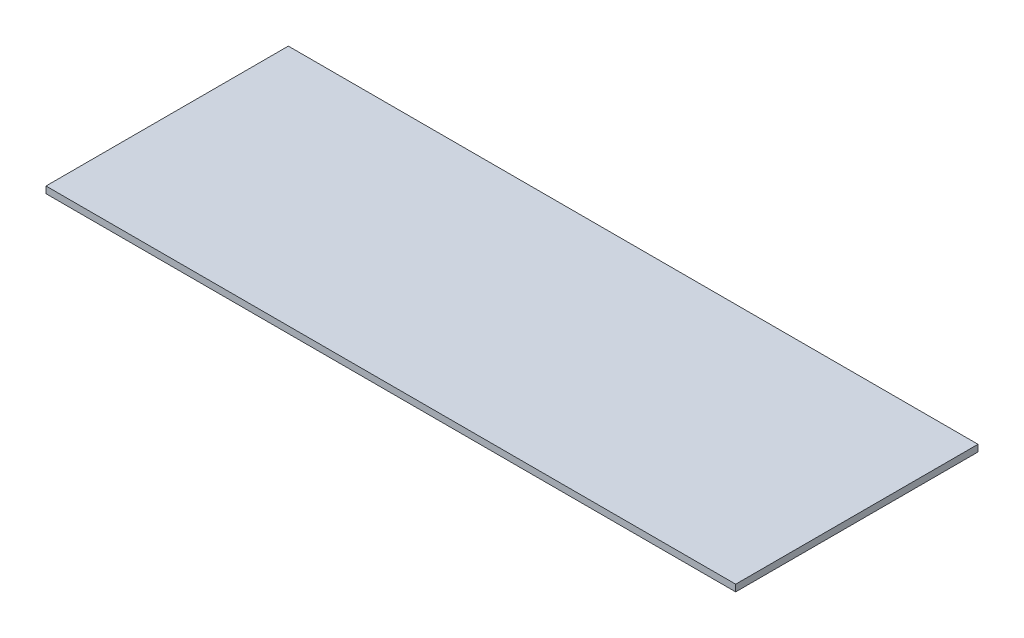
ISO-10303-21;
HEADER;
FILE_DESCRIPTION(('STEP AP214'),'2;1');
FILE_NAME('part.step','',(''),(''),'','','');
FILE_SCHEMA(('AUTOMOTIVE_DESIGN { 1 0 10303 214 1 1 1 1 }'));
ENDSEC;
DATA;
#1=APPLICATION_CONTEXT('core data for automotive mechanical design processes');
#2=APPLICATION_PROTOCOL_DEFINITION('international standard','automotive_design',2000,#1);
#3=PRODUCT_CONTEXT('',#1,'mechanical');
#4=PRODUCT('Part','Part','',(#3));
#5=PRODUCT_RELATED_PRODUCT_CATEGORY('part','',(#4));
#6=PRODUCT_DEFINITION_FORMATION('','',#4);
#7=PRODUCT_DEFINITION_CONTEXT('part definition',#1,'design');
#8=PRODUCT_DEFINITION('design','',#6,#7);
#9=PRODUCT_DEFINITION_SHAPE('','',#8);
#10=(LENGTH_UNIT() NAMED_UNIT(*) SI_UNIT(.MILLI.,.METRE.));
#11=(NAMED_UNIT(*) PLANE_ANGLE_UNIT() SI_UNIT($,.RADIAN.));
#12=(NAMED_UNIT(*) SI_UNIT($,.STERADIAN.) SOLID_ANGLE_UNIT());
#13=UNCERTAINTY_MEASURE_WITH_UNIT(LENGTH_MEASURE(1.E-05),#10,'distance_accuracy_value','');
#14=(GEOMETRIC_REPRESENTATION_CONTEXT(3) GLOBAL_UNCERTAINTY_ASSIGNED_CONTEXT((#13)) GLOBAL_UNIT_ASSIGNED_CONTEXT((#10,
#11,#12)) REPRESENTATION_CONTEXT('',''));
#15=CARTESIAN_POINT('',(0.,0.,0.));
#16=DIRECTION('',(0.,0.,1.));
#17=DIRECTION('',(1.,0.,0.));
#18=AXIS2_PLACEMENT_3D('',#15,#16,#17);
#19=CARTESIAN_POINT('',(0.,18.,0.));
#20=DIRECTION('',(1.,0.,0.));
#21=DIRECTION('',(0.,0.,-1.));
#22=AXIS2_PLACEMENT_3D('',#19,#20,#21);
#23=PLANE('',#22);
#24=DIRECTION('',(0.,0.,1.));
#25=VECTOR('',#24,1.);
#26=CARTESIAN_POINT('',(0.,0.,0.));
#27=LINE('',#26,#25);
#28=CARTESIAN_POINT('',(0.,0.,-650.));
#29=VERTEX_POINT('',#28);
#30=CARTESIAN_POINT('',(0.,0.,0.));
#31=VERTEX_POINT('',#30);
#32=EDGE_CURVE('E96',#29,#31,#27,.T.);
#33=ORIENTED_EDGE('',*,*,#32,.T.);
#34=DIRECTION('',(0.,-1.,0.));
#35=VECTOR('',#34,1.);
#36=CARTESIAN_POINT('',(0.,18.,0.));
#37=LINE('',#36,#35);
#38=CARTESIAN_POINT('',(0.,18.,0.));
#39=VERTEX_POINT('',#38);
#40=EDGE_CURVE('E11',#39,#31,#37,.T.);
#41=ORIENTED_EDGE('',*,*,#40,.F.);
#42=DIRECTION('',(0.,0.,1.));
#43=VECTOR('',#42,1.);
#44=CARTESIAN_POINT('',(0.,18.,0.));
#45=LINE('',#44,#43);
#46=CARTESIAN_POINT('',(0.,18.,-650.));
#47=VERTEX_POINT('',#46);
#48=EDGE_CURVE('E84',#47,#39,#45,.T.);
#49=ORIENTED_EDGE('',*,*,#48,.F.);
#50=DIRECTION('',(0.,-1.,0.));
#51=VECTOR('',#50,1.);
#52=CARTESIAN_POINT('',(0.,18.,-650.));
#53=LINE('',#52,#51);
#54=EDGE_CURVE('E92',#47,#29,#53,.T.);
#55=ORIENTED_EDGE('',*,*,#54,.T.);
#56=EDGE_LOOP('',(#33,#41,#49,#55));
#57=FACE_BOUND('',#56,.T.);
#58=ADVANCED_FACE('F33',(#57),#23,.F.);
#59=CARTESIAN_POINT('',(0.,18.,0.));
#60=DIRECTION('',(0.,0.,-1.));
#61=DIRECTION('',(-1.,0.,0.));
#62=AXIS2_PLACEMENT_3D('',#59,#60,#61);
#63=PLANE('',#62);
#64=DIRECTION('',(1.,0.,0.));
#65=VECTOR('',#64,1.);
#66=CARTESIAN_POINT('',(0.,0.,0.));
#67=LINE('',#66,#65);
#68=CARTESIAN_POINT('',(1850.,0.,0.));
#69=VERTEX_POINT('',#68);
#70=EDGE_CURVE('E88',#31,#69,#67,.T.);
#71=ORIENTED_EDGE('',*,*,#70,.T.);
#72=DIRECTION('',(0.,-1.,0.));
#73=VECTOR('',#72,1.);
#74=CARTESIAN_POINT('',(1850.,18.,0.));
#75=LINE('',#74,#73);
#76=CARTESIAN_POINT('',(1850.,18.,0.));
#77=VERTEX_POINT('',#76);
#78=EDGE_CURVE('E41',#77,#69,#75,.T.);
#79=ORIENTED_EDGE('',*,*,#78,.F.);
#80=DIRECTION('',(1.,0.,0.));
#81=VECTOR('',#80,1.);
#82=CARTESIAN_POINT('',(0.,18.,0.));
#83=LINE('',#82,#81);
#84=EDGE_CURVE('E79',#39,#77,#83,.T.);
#85=ORIENTED_EDGE('',*,*,#84,.F.);
#86=ORIENTED_EDGE('',*,*,#40,.T.);
#87=EDGE_LOOP('',(#71,#79,#85,#86));
#88=FACE_BOUND('',#87,.T.);
#89=ADVANCED_FACE('F87',(#88),#63,.F.);
#90=CARTESIAN_POINT('',(1850.,18.,0.));
#91=DIRECTION('',(-1.,0.,0.));
#92=DIRECTION('',(0.,0.,1.));
#93=AXIS2_PLACEMENT_3D('',#90,#91,#92);
#94=PLANE('',#93);
#95=DIRECTION('',(0.,0.,-1.));
#96=VECTOR('',#95,1.);
#97=CARTESIAN_POINT('',(1850.,0.,0.));
#98=LINE('',#97,#96);
#99=CARTESIAN_POINT('',(1850.,0.,-650.));
#100=VERTEX_POINT('',#99);
#101=EDGE_CURVE('E66',#69,#100,#98,.T.);
#102=ORIENTED_EDGE('',*,*,#101,.T.);
#103=DIRECTION('',(0.,-1.,0.));
#104=VECTOR('',#103,1.);
#105=CARTESIAN_POINT('',(1850.,18.,-650.));
#106=LINE('',#105,#104);
#107=CARTESIAN_POINT('',(1850.,18.,-650.));
#108=VERTEX_POINT('',#107);
#109=EDGE_CURVE('E89',#108,#100,#106,.T.);
#110=ORIENTED_EDGE('',*,*,#109,.F.);
#111=DIRECTION('',(0.,0.,-1.));
#112=VECTOR('',#111,1.);
#113=CARTESIAN_POINT('',(1850.,18.,0.));
#114=LINE('',#113,#112);
#115=EDGE_CURVE('E82',#77,#108,#114,.T.);
#116=ORIENTED_EDGE('',*,*,#115,.F.);
#117=ORIENTED_EDGE('',*,*,#78,.T.);
#118=EDGE_LOOP('',(#102,#110,#116,#117));
#119=FACE_BOUND('',#118,.T.);
#120=ADVANCED_FACE('F90',(#119),#94,.F.);
#121=CARTESIAN_POINT('',(0.,18.,-650.));
#122=DIRECTION('',(0.,0.,1.));
#123=DIRECTION('',(1.,0.,0.));
#124=AXIS2_PLACEMENT_3D('',#121,#122,#123);
#125=PLANE('',#124);
#126=DIRECTION('',(-1.,0.,0.));
#127=VECTOR('',#126,1.);
#128=CARTESIAN_POINT('',(0.,0.,-650.));
#129=LINE('',#128,#127);
#130=EDGE_CURVE('E72',#100,#29,#129,.T.);
#131=ORIENTED_EDGE('',*,*,#130,.T.);
#132=ORIENTED_EDGE('',*,*,#54,.F.);
#133=DIRECTION('',(-1.,0.,0.));
#134=VECTOR('',#133,1.);
#135=CARTESIAN_POINT('',(0.,18.,-650.));
#136=LINE('',#135,#134);
#137=EDGE_CURVE('E49',#108,#47,#136,.T.);
#138=ORIENTED_EDGE('',*,*,#137,.F.);
#139=ORIENTED_EDGE('',*,*,#109,.T.);
#140=EDGE_LOOP('',(#131,#132,#138,#139));
#141=FACE_BOUND('',#140,.T.);
#142=ADVANCED_FACE('F103',(#141),#125,.F.);
#143=CARTESIAN_POINT('',(0.,18.,0.));
#144=DIRECTION('',(0.,-1.,0.));
#145=DIRECTION('',(0.,0.,-1.));
#146=AXIS2_PLACEMENT_3D('',#143,#144,#145);
#147=PLANE('',#146);
#148=ORIENTED_EDGE('',*,*,#48,.T.);
#149=ORIENTED_EDGE('',*,*,#84,.T.);
#150=ORIENTED_EDGE('',*,*,#115,.T.);
#151=ORIENTED_EDGE('',*,*,#137,.T.);
#152=EDGE_LOOP('',(#148,#149,#150,#151));
#153=FACE_BOUND('',#152,.T.);
#154=ADVANCED_FACE('F80',(#153),#147,.F.);
#155=CARTESIAN_POINT('',(0.,0.,0.));
#156=DIRECTION('',(0.,-1.,0.));
#157=DIRECTION('',(0.,0.,-1.));
#158=AXIS2_PLACEMENT_3D('',#155,#156,#157);
#159=PLANE('',#158);
#160=ORIENTED_EDGE('',*,*,#32,.F.);
#161=ORIENTED_EDGE('',*,*,#130,.F.);
#162=ORIENTED_EDGE('',*,*,#101,.F.);
#163=ORIENTED_EDGE('',*,*,#70,.F.);
#164=EDGE_LOOP('',(#160,#161,#162,#163));
#165=FACE_BOUND('',#164,.T.);
#166=ADVANCED_FACE('F106',(#165),#159,.T.);
#167=CLOSED_SHELL('',(#58,#89,#120,#142,#154,#166));
#168=MANIFOLD_SOLID_BREP('B2',#167);
#169=ADVANCED_BREP_SHAPE_REPRESENTATION('',(#18,#168),#14);
#170=SHAPE_DEFINITION_REPRESENTATION(#9,#169);
ENDSEC;
END-ISO-10303-21;
